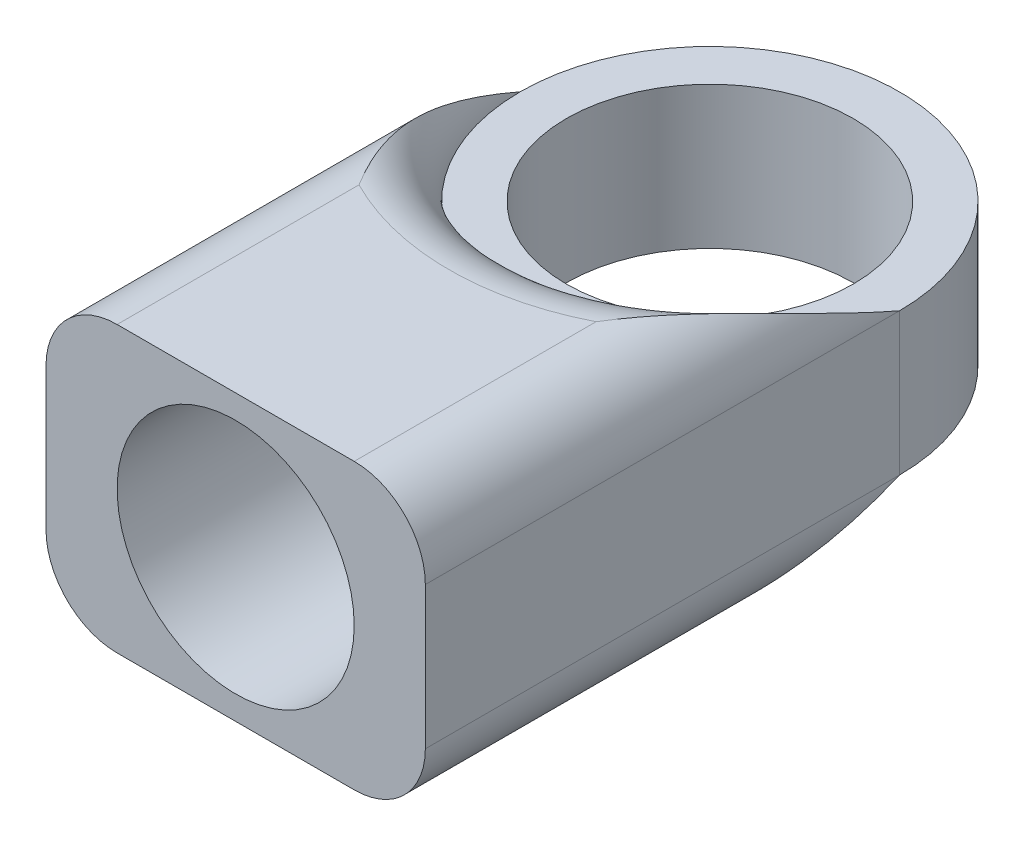
ISO-10303-21;
HEADER;
FILE_DESCRIPTION(('STEP AP214'),'2;1');
FILE_NAME('part.step','',(''),(''),'','','');
FILE_SCHEMA(('AUTOMOTIVE_DESIGN { 1 0 10303 214 1 1 1 1 }'));
ENDSEC;
DATA;
#1=APPLICATION_CONTEXT('core data for automotive mechanical design processes');
#2=APPLICATION_PROTOCOL_DEFINITION('international standard','automotive_design',2000,#1);
#3=PRODUCT_CONTEXT('',#1,'mechanical');
#4=PRODUCT('Part','Part','',(#3));
#5=PRODUCT_RELATED_PRODUCT_CATEGORY('part','',(#4));
#6=PRODUCT_DEFINITION_FORMATION('','',#4);
#7=PRODUCT_DEFINITION_CONTEXT('part definition',#1,'design');
#8=PRODUCT_DEFINITION('design','',#6,#7);
#9=PRODUCT_DEFINITION_SHAPE('','',#8);
#10=(LENGTH_UNIT() NAMED_UNIT(*) SI_UNIT(.MILLI.,.METRE.));
#11=(NAMED_UNIT(*) PLANE_ANGLE_UNIT() SI_UNIT($,.RADIAN.));
#12=(NAMED_UNIT(*) SI_UNIT($,.STERADIAN.) SOLID_ANGLE_UNIT());
#13=UNCERTAINTY_MEASURE_WITH_UNIT(LENGTH_MEASURE(1.E-05),#10,'distance_accuracy_value','');
#14=(GEOMETRIC_REPRESENTATION_CONTEXT(3) GLOBAL_UNCERTAINTY_ASSIGNED_CONTEXT((#13)) GLOBAL_UNIT_ASSIGNED_CONTEXT((#10,
#11,#12)) REPRESENTATION_CONTEXT('',''));
#15=CARTESIAN_POINT('',(0.,0.,0.));
#16=DIRECTION('',(0.,0.,1.));
#17=DIRECTION('',(1.,0.,0.));
#18=AXIS2_PLACEMENT_3D('',#15,#16,#17);
#19=CARTESIAN_POINT('',(-8.,6.,0.));
#20=DIRECTION('',(1.,0.,0.));
#21=DIRECTION('',(0.,0.,-1.));
#22=AXIS2_PLACEMENT_3D('',#19,#20,#21);
#23=PLANE('',#22);
#24=DIRECTION('',(0.,-1.,0.));
#25=VECTOR('',#24,1.);
#26=CARTESIAN_POINT('',(-8.,6.,10.));
#27=LINE('',#26,#25);
#28=CARTESIAN_POINT('',(-8.,3.,10.));
#29=VERTEX_POINT('',#28);
#30=CARTESIAN_POINT('',(-8.,-3.,10.));
#31=VERTEX_POINT('',#30);
#32=EDGE_CURVE('E204',#29,#31,#27,.T.);
#33=ORIENTED_EDGE('',*,*,#32,.F.);
#34=DIRECTION('',(0.,0.,1.));
#35=VECTOR('',#34,1.);
#36=CARTESIAN_POINT('',(-8.,3.,-2.45016556472924));
#37=LINE('',#36,#35);
#38=CARTESIAN_POINT('',(-8.,3.,-10.));
#39=VERTEX_POINT('',#38);
#40=EDGE_CURVE('E223',#29,#39,#37,.F.);
#41=ORIENTED_EDGE('',*,*,#40,.T.);
#42=DIRECTION('',(0.,-1.,0.));
#43=VECTOR('',#42,1.);
#44=CARTESIAN_POINT('',(-8.,3.,-10.));
#45=LINE('',#44,#43);
#46=CARTESIAN_POINT('',(-8.,-3.,-10.));
#47=VERTEX_POINT('',#46);
#48=EDGE_CURVE('E196',#47,#39,#45,.F.);
#49=ORIENTED_EDGE('',*,*,#48,.F.);
#50=DIRECTION('',(0.,0.,1.));
#51=VECTOR('',#50,1.);
#52=CARTESIAN_POINT('',(-8.,-3.,0.));
#53=LINE('',#52,#51);
#54=EDGE_CURVE('E221',#47,#31,#53,.T.);
#55=ORIENTED_EDGE('',*,*,#54,.T.);
#56=EDGE_LOOP('',(#33,#41,#49,#55));
#57=FACE_BOUND('',#56,.T.);
#58=ADVANCED_FACE('F37',(#57),#23,.F.);
#59=CARTESIAN_POINT('',(0.,6.,10.));
#60=DIRECTION('',(0.,0.,-1.));
#61=DIRECTION('',(-1.,0.,0.));
#62=AXIS2_PLACEMENT_3D('',#59,#60,#61);
#63=PLANE('',#62);
#64=CARTESIAN_POINT('',(0.,0.,10.));
#65=DIRECTION('',(0.,0.,1.));
#66=DIRECTION('',(1.,0.,0.));
#67=AXIS2_PLACEMENT_3D('',#64,#65,#66);
#68=CIRCLE('',#67,5.);
#69=CARTESIAN_POINT('',(5.,0.,10.));
#70=VERTEX_POINT('',#69);
#71=EDGE_CURVE('E245',#70,#70,#68,.T.);
#72=ORIENTED_EDGE('',*,*,#71,.F.);
#73=EDGE_LOOP('',(#72));
#74=FACE_BOUND('',#73,.T.);
#75=DIRECTION('',(1.,0.,0.));
#76=VECTOR('',#75,1.);
#77=CARTESIAN_POINT('',(0.,6.,10.));
#78=LINE('',#77,#76);
#79=CARTESIAN_POINT('',(-5.,6.,10.));
#80=VERTEX_POINT('',#79);
#81=CARTESIAN_POINT('',(5.,6.,10.));
#82=VERTEX_POINT('',#81);
#83=EDGE_CURVE('E124',#80,#82,#78,.T.);
#84=ORIENTED_EDGE('',*,*,#83,.F.);
#85=CARTESIAN_POINT('',(-5.,3.,10.));
#86=DIRECTION('',(0.,0.,-1.));
#87=DIRECTION('',(-1.,0.,0.));
#88=AXIS2_PLACEMENT_3D('',#85,#86,#87);
#89=CIRCLE('',#88,3.);
#90=EDGE_CURVE('E219',#80,#29,#89,.F.);
#91=ORIENTED_EDGE('',*,*,#90,.T.);
#92=ORIENTED_EDGE('',*,*,#32,.T.);
#93=CARTESIAN_POINT('',(-5.,-3.,10.));
#94=DIRECTION('',(0.,0.,-1.));
#95=DIRECTION('',(-1.,0.,0.));
#96=AXIS2_PLACEMENT_3D('',#93,#94,#95);
#97=CIRCLE('',#96,3.);
#98=CARTESIAN_POINT('',(-5.,-6.,10.));
#99=VERTEX_POINT('',#98);
#100=EDGE_CURVE('E195',#31,#99,#97,.F.);
#101=ORIENTED_EDGE('',*,*,#100,.T.);
#102=DIRECTION('',(1.,0.,0.));
#103=VECTOR('',#102,1.);
#104=CARTESIAN_POINT('',(0.,-6.,10.));
#105=LINE('',#104,#103);
#106=CARTESIAN_POINT('',(5.,-6.,10.));
#107=VERTEX_POINT('',#106);
#108=EDGE_CURVE('E188',#99,#107,#105,.T.);
#109=ORIENTED_EDGE('',*,*,#108,.T.);
#110=CARTESIAN_POINT('',(5.,-3.,10.));
#111=DIRECTION('',(0.,0.,-1.));
#112=DIRECTION('',(-1.,0.,0.));
#113=AXIS2_PLACEMENT_3D('',#110,#111,#112);
#114=CIRCLE('',#113,3.);
#115=CARTESIAN_POINT('',(8.,-3.,10.));
#116=VERTEX_POINT('',#115);
#117=EDGE_CURVE('E193',#107,#116,#114,.F.);
#118=ORIENTED_EDGE('',*,*,#117,.T.);
#119=DIRECTION('',(0.,-1.,0.));
#120=VECTOR('',#119,1.);
#121=CARTESIAN_POINT('',(8.,6.,10.));
#122=LINE('',#121,#120);
#123=CARTESIAN_POINT('',(8.,3.,10.));
#124=VERTEX_POINT('',#123);
#125=EDGE_CURVE('E111',#124,#116,#122,.T.);
#126=ORIENTED_EDGE('',*,*,#125,.F.);
#127=CARTESIAN_POINT('',(5.,3.,10.));
#128=DIRECTION('',(0.,0.,-1.));
#129=DIRECTION('',(-1.,0.,0.));
#130=AXIS2_PLACEMENT_3D('',#127,#128,#129);
#131=CIRCLE('',#130,3.);
#132=EDGE_CURVE('E215',#124,#82,#131,.F.);
#133=ORIENTED_EDGE('',*,*,#132,.T.);
#134=EDGE_LOOP('',(#84,#91,#92,#101,#109,#118,#126,#133));
#135=FACE_BOUND('',#134,.T.);
#136=ADVANCED_FACE('F192',(#74,#135),#63,.F.);
#137=CARTESIAN_POINT('',(8.,6.,0.));
#138=DIRECTION('',(1.,0.,0.));
#139=DIRECTION('',(0.,0.,-1.));
#140=AXIS2_PLACEMENT_3D('',#137,#138,#139);
#141=PLANE('',#140);
#142=ORIENTED_EDGE('',*,*,#125,.T.);
#143=DIRECTION('',(0.,0.,1.));
#144=VECTOR('',#143,1.);
#145=CARTESIAN_POINT('',(8.,-3.,-2.45016556472925));
#146=LINE('',#145,#144);
#147=CARTESIAN_POINT('',(8.,-3.,-10.));
#148=VERTEX_POINT('',#147);
#149=EDGE_CURVE('E11',#116,#148,#146,.F.);
#150=ORIENTED_EDGE('',*,*,#149,.T.);
#151=DIRECTION('',(0.,-1.,0.));
#152=VECTOR('',#151,1.);
#153=CARTESIAN_POINT('',(8.,6.,-10.));
#154=LINE('',#153,#152);
#155=CARTESIAN_POINT('',(8.,3.,-10.));
#156=VERTEX_POINT('',#155);
#157=EDGE_CURVE('E108',#156,#148,#154,.T.);
#158=ORIENTED_EDGE('',*,*,#157,.F.);
#159=DIRECTION('',(0.,0.,1.));
#160=VECTOR('',#159,1.);
#161=CARTESIAN_POINT('',(8.,3.,0.));
#162=LINE('',#161,#160);
#163=EDGE_CURVE('E46',#156,#124,#162,.T.);
#164=ORIENTED_EDGE('',*,*,#163,.T.);
#165=EDGE_LOOP('',(#142,#150,#158,#164));
#166=FACE_BOUND('',#165,.T.);
#167=ADVANCED_FACE('F106',(#166),#141,.T.);
#168=CARTESIAN_POINT('',(0.,6.,0.));
#169=DIRECTION('',(0.,1.,0.));
#170=DIRECTION('',(0.,0.,1.));
#171=AXIS2_PLACEMENT_3D('',#168,#169,#170);
#172=PLANE('',#171);
#173=CARTESIAN_POINT('',(0.,6.,-10.));
#174=DIRECTION('',(0.,1.,0.));
#175=DIRECTION('',(0.,0.,1.));
#176=AXIS2_PLACEMENT_3D('',#173,#174,#175);
#177=CIRCLE('',#176,11.);
#178=CARTESIAN_POINT('',(5.,6.,-0.202041028867284));
#179=VERTEX_POINT('',#178);
#180=CARTESIAN_POINT('',(-5.,6.,-0.202041028867282));
#181=VERTEX_POINT('',#180);
#182=EDGE_CURVE('E207',#179,#181,#177,.F.);
#183=ORIENTED_EDGE('',*,*,#182,.T.);
#184=DIRECTION('',(0.,0.,1.));
#185=VECTOR('',#184,1.);
#186=CARTESIAN_POINT('',(-5.,6.,10.));
#187=LINE('',#186,#185);
#188=EDGE_CURVE('E212',#181,#80,#187,.T.);
#189=ORIENTED_EDGE('',*,*,#188,.T.);
#190=ORIENTED_EDGE('',*,*,#83,.T.);
#191=DIRECTION('',(0.,0.,1.));
#192=VECTOR('',#191,1.);
#193=CARTESIAN_POINT('',(5.,6.,0.));
#194=LINE('',#193,#192);
#195=EDGE_CURVE('E210',#82,#179,#194,.F.);
#196=ORIENTED_EDGE('',*,*,#195,.T.);
#197=EDGE_LOOP('',(#183,#189,#190,#196));
#198=FACE_BOUND('',#197,.T.);
#199=ADVANCED_FACE('F236',(#198),#172,.T.);
#200=CARTESIAN_POINT('',(0.,-6.,0.));
#201=DIRECTION('',(0.,1.,0.));
#202=DIRECTION('',(0.,0.,1.));
#203=AXIS2_PLACEMENT_3D('',#200,#201,#202);
#204=PLANE('',#203);
#205=ORIENTED_EDGE('',*,*,#108,.F.);
#206=DIRECTION('',(0.,0.,1.));
#207=VECTOR('',#206,1.);
#208=CARTESIAN_POINT('',(-5.,-6.,0.));
#209=LINE('',#208,#207);
#210=CARTESIAN_POINT('',(-5.,-6.,-0.202041028867282));
#211=VERTEX_POINT('',#210);
#212=EDGE_CURVE('E60',#99,#211,#209,.F.);
#213=ORIENTED_EDGE('',*,*,#212,.T.);
#214=CARTESIAN_POINT('',(0.,-6.,-10.));
#215=DIRECTION('',(0.,1.,0.));
#216=DIRECTION('',(0.,0.,1.));
#217=AXIS2_PLACEMENT_3D('',#214,#215,#216);
#218=CIRCLE('',#217,11.);
#219=CARTESIAN_POINT('',(5.,-6.,-0.202041028867284));
#220=VERTEX_POINT('',#219);
#221=EDGE_CURVE('E189',#211,#220,#218,.T.);
#222=ORIENTED_EDGE('',*,*,#221,.T.);
#223=DIRECTION('',(0.,0.,1.));
#224=VECTOR('',#223,1.);
#225=CARTESIAN_POINT('',(5.,-6.,10.));
#226=LINE('',#225,#224);
#227=EDGE_CURVE('E141',#220,#107,#226,.T.);
#228=ORIENTED_EDGE('',*,*,#227,.T.);
#229=EDGE_LOOP('',(#205,#213,#222,#228));
#230=FACE_BOUND('',#229,.T.);
#231=ADVANCED_FACE('F187',(#230),#204,.F.);
#232=CARTESIAN_POINT('',(0.,3.,-10.));
#233=DIRECTION('',(0.,-1.,0.));
#234=DIRECTION('',(0.,0.,-1.));
#235=AXIS2_PLACEMENT_3D('',#232,#233,#234);
#236=CYLINDRICAL_SURFACE('',#235,8.00000000000001);
#237=CARTESIAN_POINT('',(0.,-3.,-10.));
#238=DIRECTION('',(0.,1.,0.));
#239=DIRECTION('',(0.,0.,1.));
#240=AXIS2_PLACEMENT_3D('',#237,#238,#239);
#241=CIRCLE('',#240,8.00000000000001);
#242=EDGE_CURVE('E119',#148,#47,#241,.T.);
#243=ORIENTED_EDGE('',*,*,#242,.T.);
#244=ORIENTED_EDGE('',*,*,#48,.T.);
#245=CARTESIAN_POINT('',(0.,3.,-10.));
#246=DIRECTION('',(0.,1.,0.));
#247=DIRECTION('',(0.,0.,1.));
#248=AXIS2_PLACEMENT_3D('',#245,#246,#247);
#249=CIRCLE('',#248,8.00000000000001);
#250=EDGE_CURVE('E122',#156,#39,#249,.T.);
#251=ORIENTED_EDGE('',*,*,#250,.F.);
#252=ORIENTED_EDGE('',*,*,#157,.T.);
#253=EDGE_LOOP('',(#243,#244,#251,#252));
#254=FACE_BOUND('',#253,.T.);
#255=ADVANCED_FACE('F117',(#254),#236,.T.);
#256=CARTESIAN_POINT('',(0.,3.,-10.));
#257=DIRECTION('',(0.,-1.,0.));
#258=DIRECTION('',(0.,0.,-1.));
#259=AXIS2_PLACEMENT_3D('',#256,#257,#258);
#260=CYLINDRICAL_SURFACE('',#259,6.05);
#261=CARTESIAN_POINT('',(0.,3.,-10.));
#262=DIRECTION('',(0.,1.,0.));
#263=DIRECTION('',(0.,0.,1.));
#264=AXIS2_PLACEMENT_3D('',#261,#262,#263);
#265=CIRCLE('',#264,6.05);
#266=CARTESIAN_POINT('',(0.,3.,-3.95));
#267=VERTEX_POINT('',#266);
#268=EDGE_CURVE('E200',#267,#267,#265,.T.);
#269=ORIENTED_EDGE('',*,*,#268,.T.);
#270=EDGE_LOOP('',(#269));
#271=FACE_BOUND('',#270,.T.);
#272=CARTESIAN_POINT('',(0.,-3.,-10.));
#273=DIRECTION('',(0.,1.,0.));
#274=DIRECTION('',(0.,0.,1.));
#275=AXIS2_PLACEMENT_3D('',#272,#273,#274);
#276=CIRCLE('',#275,6.05);
#277=CARTESIAN_POINT('',(0.,-3.,-3.95));
#278=VERTEX_POINT('',#277);
#279=EDGE_CURVE('E131',#278,#278,#276,.T.);
#280=ORIENTED_EDGE('',*,*,#279,.F.);
#281=EDGE_LOOP('',(#280));
#282=FACE_BOUND('',#281,.T.);
#283=ADVANCED_FACE('F251',(#271,#282),#260,.F.);
#284=CARTESIAN_POINT('',(0.,3.,0.));
#285=DIRECTION('',(0.,1.,0.));
#286=DIRECTION('',(0.,0.,1.));
#287=AXIS2_PLACEMENT_3D('',#284,#285,#286);
#288=PLANE('',#287);
#289=ORIENTED_EDGE('',*,*,#250,.T.);
#290=EDGE_CURVE('E231',#39,#156,#249,.T.);
#291=ORIENTED_EDGE('',*,*,#290,.T.);
#292=EDGE_LOOP('',(#289,#291));
#293=FACE_BOUND('',#292,.T.);
#294=ORIENTED_EDGE('',*,*,#268,.F.);
#295=EDGE_LOOP('',(#294));
#296=FACE_BOUND('',#295,.T.);
#297=ADVANCED_FACE('F239',(#293,#296),#288,.T.);
#298=CARTESIAN_POINT('',(0.,-3.,0.));
#299=DIRECTION('',(0.,1.,0.));
#300=DIRECTION('',(0.,0.,1.));
#301=AXIS2_PLACEMENT_3D('',#298,#299,#300);
#302=PLANE('',#301);
#303=ORIENTED_EDGE('',*,*,#242,.F.);
#304=EDGE_CURVE('E130',#47,#148,#241,.T.);
#305=ORIENTED_EDGE('',*,*,#304,.F.);
#306=EDGE_LOOP('',(#303,#305));
#307=FACE_BOUND('',#306,.T.);
#308=ORIENTED_EDGE('',*,*,#279,.T.);
#309=EDGE_LOOP('',(#308));
#310=FACE_BOUND('',#309,.T.);
#311=ADVANCED_FACE('F128',(#307,#310),#302,.F.);
#312=CARTESIAN_POINT('',(0.,-3.,-10.));
#313=DIRECTION('',(0.,1.,0.));
#314=DIRECTION('',(0.,0.,1.));
#315=AXIS2_PLACEMENT_3D('',#312,#313,#314);
#316=TOROIDAL_SURFACE('',#315,11.,3.);
#317=ORIENTED_EDGE('',*,*,#221,.F.);
#318=CARTESIAN_POINT('',(-8.00000000000001,-3.,-10.));
#319=CARTESIAN_POINT('',(-8.00000000238187,-3.00236938429621,-9.99452814085888));
#320=CARTESIAN_POINT('',(-7.99999719533205,-3.00473878022632,-9.98905625536137));
#321=CARTESIAN_POINT('',(-7.99956607533284,-3.18661668814079,-9.56902637174416));
#322=CARTESIAN_POINT('',(-7.98301569809308,-3.36616064541197,-9.15432309087172));
#323=CARTESIAN_POINT('',(-7.91772871403377,-3.72067669595112,-8.32528849779677));
#324=CARTESIAN_POINT('',(-7.86897330662509,-3.89564605660742,-7.9109575445133));
#325=CARTESIAN_POINT('',(-7.73934080786373,-4.23667967435584,-7.08225727863208));
#326=CARTESIAN_POINT('',(-7.65837628085581,-4.40271828341701,-6.66789095674307));
#327=CARTESIAN_POINT('',(-7.46481833790684,-4.72024135746883,-5.84107810714184));
#328=CARTESIAN_POINT('',(-7.35223569790133,-4.87173075748743,-5.42863097394107));
#329=CARTESIAN_POINT('',(-7.11649587038113,-5.1321862440565,-4.67160074022123));
#330=CARTESIAN_POINT('',(-6.9978429429415,-5.24408653724895,-4.32662260711334));
#331=CARTESIAN_POINT('',(-6.73928462531251,-5.44993919136526,-3.63909986623909));
#332=CARTESIAN_POINT('',(-6.59937379206972,-5.54388694161948,-3.29655590531998));
#333=CARTESIAN_POINT('',(-6.29988146814707,-5.70914259522496,-2.61629871375462));
#334=CARTESIAN_POINT('',(-6.14038126549099,-5.78053994092437,-2.27857160411872));
#335=CARTESIAN_POINT('',(-5.80270467561814,-5.89611550447883,-1.60800231284478));
#336=CARTESIAN_POINT('',(-5.62454672824729,-5.94032030569349,-1.27515567188873));
#337=CARTESIAN_POINT('',(-5.36833308575712,-5.97813629419555,-0.822385987564284));
#338=CARTESIAN_POINT('',(-5.29738185072591,-5.98609810731002,-0.699528895858318));
#339=CARTESIAN_POINT('',(-5.15330476854414,-5.99695141374966,-0.454886570779086));
#340=CARTESIAN_POINT('',(-5.0801794915898,-5.99984422482155,-0.333101067027439));
#341=CARTESIAN_POINT('',(-5.0040402836105,-5.99999795740113,-0.208640449523039));
#342=CARTESIAN_POINT('',(-5.00202050989815,-5.99999999855977,-0.205340506138666));
#343=CARTESIAN_POINT('',(-5.,-6.,-0.202041028867282));
#344=B_SPLINE_CURVE_WITH_KNOTS('',3,(#318,#319,#320,#321,#322,#323,#324,#325,#326,#327,#328,
#329,#330,#331,#332,#333,#334,#335,#336,#337,#338,#339,#340,#341,#342,#343),.UNSPECIFIED.,.F.,
.F.,(4,2,2,2,2,2,2,2,2,2,2,2,4),(0.,0.0178885458022666,1.37314442199724,2.72919216685201,
4.08894646957498,5.44823790849126,6.59208561892515,7.73622670487745,8.87577104149564,
10.0141995847887,10.4404105615964,10.8665107234004,10.8781177032022),.UNSPECIFIED.);
#345=EDGE_CURVE('E135',#211,#47,#344,.F.);
#346=ORIENTED_EDGE('',*,*,#345,.T.);
#347=ORIENTED_EDGE('',*,*,#304,.T.);
#348=CARTESIAN_POINT('',(8.,-3.,-10.));
#349=CARTESIAN_POINT('',(8.00000000238187,-3.00236938429656,-9.99452814085903));
#350=CARTESIAN_POINT('',(7.99999719533205,-3.00473878022702,-9.98905625536167));
#351=CARTESIAN_POINT('',(7.99956607533283,-3.18661668816734,-9.56902637175599));
#352=CARTESIAN_POINT('',(7.9830156980931,-3.36616064541889,-9.15432309087538));
#353=CARTESIAN_POINT('',(7.91772871403387,-3.72067669594354,-8.32528849779472));
#354=CARTESIAN_POINT('',(7.86897330662525,-3.89564605660499,-7.91095754451371));
#355=CARTESIAN_POINT('',(7.73934080786394,-4.23667967435731,-7.08225727863404));
#356=CARTESIAN_POINT('',(7.65837628085598,-4.40271828341721,-6.66789095674409));
#357=CARTESIAN_POINT('',(7.46481833790693,-4.7202413574682,-5.84107810714194));
#358=CARTESIAN_POINT('',(7.35223569790137,-4.87173075748725,-5.42863097394118));
#359=CARTESIAN_POINT('',(7.11649587038367,-5.13218624405381,-4.67160074022941));
#360=CARTESIAN_POINT('',(6.9978429429471,-5.24408653724371,-4.32662260712958));
#361=CARTESIAN_POINT('',(6.73928462532513,-5.44993919135598,-3.63909986627134));
#362=CARTESIAN_POINT('',(6.5993737920863,-5.54388694160871,-3.29655590536018));
#363=CARTESIAN_POINT('',(6.29988146817301,-5.70914259521225,-2.61629871381104));
#364=CARTESIAN_POINT('',(6.14038126552238,-5.78053994091127,-2.27857160418339));
#365=CARTESIAN_POINT('',(5.80270467566029,-5.89611550446675,-1.60800231292615));
#366=CARTESIAN_POINT('',(5.62454672829476,-5.94032030568281,-1.27515567197855));
#367=CARTESIAN_POINT('',(5.36833308580381,-5.97813629419003,-0.822385987644575));
#368=CARTESIAN_POINT('',(5.29738185076439,-5.98609810730651,-0.69952889592197));
#369=CARTESIAN_POINT('',(5.15330476856231,-5.9969514137489,-0.454886570811649));
#370=CARTESIAN_POINT('',(5.08017949159589,-5.99984422482153,-0.33310106704555));
#371=CARTESIAN_POINT('',(5.0040402836103,-5.99999795740113,-0.208640449523156));
#372=CARTESIAN_POINT('',(5.00202050989805,-5.99999999855977,-0.205340506138727));
#373=CARTESIAN_POINT('',(5.,-6.,-0.202041028867284));
#374=B_SPLINE_CURVE_WITH_KNOTS('',3,(#348,#349,#350,#351,#352,#353,#354,#355,#356,#357,#358,
#359,#360,#361,#362,#363,#364,#365,#366,#367,#368,#369,#370,#371,#372,#373),.UNSPECIFIED.,.F.,
.F.,(4,2,2,2,2,2,2,2,2,2,2,2,4),(0.,0.0178885458022635,1.37314442199633,2.72919216685043,
4.08894646957446,5.44823790849126,6.59208561889825,7.7362267048238,8.87577104141295,
10.0141995846772,10.4404105615406,10.8665107234005,10.8781177032023),.UNSPECIFIED.);
#375=EDGE_CURVE('E53',#148,#220,#374,.T.);
#376=ORIENTED_EDGE('',*,*,#375,.T.);
#377=EDGE_LOOP('',(#317,#346,#347,#376));
#378=FACE_BOUND('',#377,.T.);
#379=ADVANCED_FACE('F133',(#378),#316,.T.);
#380=CARTESIAN_POINT('',(0.,3.,-10.));
#381=DIRECTION('',(0.,1.,0.));
#382=DIRECTION('',(0.,0.,1.));
#383=AXIS2_PLACEMENT_3D('',#380,#381,#382);
#384=TOROIDAL_SURFACE('',#383,11.,3.);
#385=ORIENTED_EDGE('',*,*,#290,.F.);
#386=CARTESIAN_POINT('',(-8.00000000000001,3.,-10.));
#387=CARTESIAN_POINT('',(-8.00000000238187,3.00236938429621,-9.99452814085888));
#388=CARTESIAN_POINT('',(-7.99999719533205,3.00473878022632,-9.98905625536137));
#389=CARTESIAN_POINT('',(-7.99956607533284,3.1866166881408,-9.56902637174412));
#390=CARTESIAN_POINT('',(-7.98301569809308,3.366160645412,-9.15432309087164));
#391=CARTESIAN_POINT('',(-7.91772871403375,3.72067669595119,-8.32528849779661));
#392=CARTESIAN_POINT('',(-7.86897330662507,3.8956460566075,-7.9109575445131));
#393=CARTESIAN_POINT('',(-7.73934080786369,4.23667967435592,-7.08225727863188));
#394=CARTESIAN_POINT('',(-7.65837628085577,4.40271828341707,-6.66789095674291));
#395=CARTESIAN_POINT('',(-7.46481833790682,4.72024135746886,-5.84107810714176));
#396=CARTESIAN_POINT('',(-7.35223569790132,4.87173075748745,-5.42863097394102));
#397=CARTESIAN_POINT('',(-7.11649587038118,5.13218624405645,-4.67160074022139));
#398=CARTESIAN_POINT('',(-6.9978429429416,5.24408653724885,-4.32662260711368));
#399=CARTESIAN_POINT('',(-6.73928462531276,5.44993919136508,-3.63909986623973));
#400=CARTESIAN_POINT('',(-6.59937379207007,5.54388694161927,-3.29655590532075));
#401=CARTESIAN_POINT('',(-6.2998814681475,5.70914259522474,-2.61629871375561));
#402=CARTESIAN_POINT('',(-6.1403812654914,5.78053994092416,-2.27857160411978));
#403=CARTESIAN_POINT('',(-5.80270467561879,5.89611550447867,-1.60800231284582));
#404=CARTESIAN_POINT('',(-5.62454672824822,5.94032030569336,-1.27515567188969));
#405=CARTESIAN_POINT('',(-5.36833308575758,5.97813629419548,-0.822385987565338));
#406=CARTESIAN_POINT('',(-5.29738185072607,5.98609810730998,-0.699528895859278));
#407=CARTESIAN_POINT('',(-5.15330476854467,5.99695141374965,-0.454886570779283));
#408=CARTESIAN_POINT('',(-5.08017949159101,5.99984422482155,-0.333101067026966));
#409=CARTESIAN_POINT('',(-5.00404028361056,5.99999795740113,-0.208640449523005));
#410=CARTESIAN_POINT('',(-5.00202050989818,5.99999999855977,-0.205340506138649));
#411=CARTESIAN_POINT('',(-5.,6.,-0.202041028867282));
#412=B_SPLINE_CURVE_WITH_KNOTS('',3,(#386,#387,#388,#389,#390,#391,#392,#393,#394,#395,#396,
#397,#398,#399,#400,#401,#402,#403,#404,#405,#406,#407,#408,#409,#410,#411),.UNSPECIFIED.,.F.,
.F.,(4,2,2,2,2,2,2,2,2,2,2,2,4),(0.,0.0178885458022666,1.37314442199736,2.72919216685226,
4.08894646957512,5.44823790849126,6.59208561892461,7.73622670487641,8.87577104149446,
10.0141995847873,10.4404105615957,10.8665107234004,10.8781177032022),.UNSPECIFIED.);
#413=EDGE_CURVE('E174',#39,#181,#412,.T.);
#414=ORIENTED_EDGE('',*,*,#413,.T.);
#415=ORIENTED_EDGE('',*,*,#182,.F.);
#416=CARTESIAN_POINT('',(8.,3.,-10.));
#417=CARTESIAN_POINT('',(8.00000000238187,3.00236938429656,-9.99452814085903));
#418=CARTESIAN_POINT('',(7.99999719533205,3.00473878022702,-9.98905625536167));
#419=CARTESIAN_POINT('',(7.99956607533283,3.18661668816727,-9.56902637175582));
#420=CARTESIAN_POINT('',(7.98301569809309,3.36616064541896,-9.15432309087513));
#421=CARTESIAN_POINT('',(7.91772871403382,3.72067669594378,-8.32528849779425));
#422=CARTESIAN_POINT('',(7.86897330662517,3.89564605660525,-7.91095754451312));
#423=CARTESIAN_POINT('',(7.73934080786382,4.23667967435755,-7.08225727863342));
#424=CARTESIAN_POINT('',(7.65837628085587,4.4027182834174,-6.66789095674359));
#425=CARTESIAN_POINT('',(7.46481833790686,4.7202413574683,-5.84107810714168));
#426=CARTESIAN_POINT('',(7.35223569790134,4.8717307574873,-5.42863097394104));
#427=CARTESIAN_POINT('',(7.11649587038155,5.13218624405614,-4.67160074022265));
#428=CARTESIAN_POINT('',(6.99784294294243,5.24408653724809,-4.3266226071161));
#429=CARTESIAN_POINT('',(6.73928462531461,5.4499391913637,-3.63909986624443));
#430=CARTESIAN_POINT('',(6.59937379207246,5.54388694161771,-3.29655590532655));
#431=CARTESIAN_POINT('',(6.29988146815136,5.70914259522284,-2.61629871376403));
#432=CARTESIAN_POINT('',(6.14038126549621,5.78053994092215,-2.27857160412972));
#433=CARTESIAN_POINT('',(5.80270467562554,5.89611550447672,-1.60800231285885));
#434=CARTESIAN_POINT('',(5.62454672825595,5.94032030569161,-1.27515567190429));
#435=CARTESIAN_POINT('',(5.36833308576527,5.97813629419457,-0.822385987578579));
#436=CARTESIAN_POINT('',(5.29738185073239,5.9860981073094,-0.699528895869796));
#437=CARTESIAN_POINT('',(5.15330476854769,5.99695141374953,-0.454886570784653));
#438=CARTESIAN_POINT('',(5.08017949159209,5.99984422482154,-0.333101067029911));
#439=CARTESIAN_POINT('',(5.00404028361053,5.99999795740113,-0.208640449523023));
#440=CARTESIAN_POINT('',(5.00202050989817,5.99999999855977,-0.205340506138659));
#441=CARTESIAN_POINT('',(5.,6.,-0.202041028867284));
#442=B_SPLINE_CURVE_WITH_KNOTS('',3,(#416,#417,#418,#419,#420,#421,#422,#423,#424,#425,#426,
#427,#428,#429,#430,#431,#432,#433,#434,#435,#436,#437,#438,#439,#440,#441),.UNSPECIFIED.,.F.,
.F.,(4,2,2,2,2,2,2,2,2,2,2,2,4),(0.,0.0178885458022632,1.37314442199671,2.72919216685122,
4.08894646957489,5.44823790849126,6.59208561892061,7.73622670486872,8.87577104148147,
10.014199584769,10.4404105615865,10.8665107234004,10.8781177032023),.UNSPECIFIED.);
#443=EDGE_CURVE('E180',#179,#156,#442,.F.);
#444=ORIENTED_EDGE('',*,*,#443,.T.);
#445=EDGE_LOOP('',(#385,#414,#415,#444));
#446=FACE_BOUND('',#445,.T.);
#447=ADVANCED_FACE('F171',(#446),#384,.T.);
#448=CARTESIAN_POINT('',(0.,0.,0.));
#449=DIRECTION('',(0.,0.,1.));
#450=DIRECTION('',(1.,0.,0.));
#451=AXIS2_PLACEMENT_3D('',#448,#449,#450);
#452=CYLINDRICAL_SURFACE('',#451,5.);
#453=CARTESIAN_POINT('',(0.,0.,0.));
#454=DIRECTION('',(0.,0.,1.));
#455=DIRECTION('',(1.,0.,0.));
#456=AXIS2_PLACEMENT_3D('',#453,#454,#455);
#457=CIRCLE('',#456,5.);
#458=CARTESIAN_POINT('',(5.,0.,0.));
#459=VERTEX_POINT('',#458);
#460=EDGE_CURVE('E137',#459,#459,#457,.T.);
#461=ORIENTED_EDGE('',*,*,#460,.F.);
#462=EDGE_LOOP('',(#461));
#463=FACE_BOUND('',#462,.T.);
#464=ORIENTED_EDGE('',*,*,#71,.T.);
#465=EDGE_LOOP('',(#464));
#466=FACE_BOUND('',#465,.T.);
#467=ADVANCED_FACE('F318',(#463,#466),#452,.F.);
#468=CARTESIAN_POINT('',(0.,0.,0.));
#469=DIRECTION('',(0.,0.,1.));
#470=DIRECTION('',(1.,0.,0.));
#471=AXIS2_PLACEMENT_3D('',#468,#469,#470);
#472=PLANE('',#471);
#473=ORIENTED_EDGE('',*,*,#460,.T.);
#474=EDGE_LOOP('',(#473));
#475=FACE_BOUND('',#474,.T.);
#476=ADVANCED_FACE('F169',(#475),#472,.T.);
#477=CARTESIAN_POINT('',(-5.,3.,0.));
#478=DIRECTION('',(0.,0.,-1.));
#479=DIRECTION('',(-1.,0.,0.));
#480=AXIS2_PLACEMENT_3D('',#477,#478,#479);
#481=CYLINDRICAL_SURFACE('',#480,3.);
#482=ORIENTED_EDGE('',*,*,#413,.F.);
#483=ORIENTED_EDGE('',*,*,#40,.F.);
#484=ORIENTED_EDGE('',*,*,#90,.F.);
#485=ORIENTED_EDGE('',*,*,#188,.F.);
#486=EDGE_LOOP('',(#482,#483,#484,#485));
#487=FACE_BOUND('',#486,.T.);
#488=ADVANCED_FACE('F165',(#487),#481,.T.);
#489=CARTESIAN_POINT('',(-5.,-3.,0.));
#490=DIRECTION('',(0.,0.,1.));
#491=DIRECTION('',(1.,0.,0.));
#492=AXIS2_PLACEMENT_3D('',#489,#490,#491);
#493=CYLINDRICAL_SURFACE('',#492,3.);
#494=ORIENTED_EDGE('',*,*,#345,.F.);
#495=ORIENTED_EDGE('',*,*,#212,.F.);
#496=ORIENTED_EDGE('',*,*,#100,.F.);
#497=ORIENTED_EDGE('',*,*,#54,.F.);
#498=EDGE_LOOP('',(#494,#495,#496,#497));
#499=FACE_BOUND('',#498,.T.);
#500=ADVANCED_FACE('F161',(#499),#493,.T.);
#501=CARTESIAN_POINT('',(5.,-3.,0.));
#502=DIRECTION('',(0.,0.,-1.));
#503=DIRECTION('',(-1.,0.,0.));
#504=AXIS2_PLACEMENT_3D('',#501,#502,#503);
#505=CYLINDRICAL_SURFACE('',#504,3.);
#506=ORIENTED_EDGE('',*,*,#375,.F.);
#507=ORIENTED_EDGE('',*,*,#149,.F.);
#508=ORIENTED_EDGE('',*,*,#117,.F.);
#509=ORIENTED_EDGE('',*,*,#227,.F.);
#510=EDGE_LOOP('',(#506,#507,#508,#509));
#511=FACE_BOUND('',#510,.T.);
#512=ADVANCED_FACE('F139',(#511),#505,.T.);
#513=CARTESIAN_POINT('',(5.,3.,0.));
#514=DIRECTION('',(0.,0.,1.));
#515=DIRECTION('',(1.,0.,0.));
#516=AXIS2_PLACEMENT_3D('',#513,#514,#515);
#517=CYLINDRICAL_SURFACE('',#516,3.);
#518=ORIENTED_EDGE('',*,*,#443,.F.);
#519=ORIENTED_EDGE('',*,*,#195,.F.);
#520=ORIENTED_EDGE('',*,*,#132,.F.);
#521=ORIENTED_EDGE('',*,*,#163,.F.);
#522=EDGE_LOOP('',(#518,#519,#520,#521));
#523=FACE_BOUND('',#522,.T.);
#524=ADVANCED_FACE('F39',(#523),#517,.T.);
#525=CLOSED_SHELL('',(#58,#136,#167,#199,#231,#255,#283,#297,#311,#379,#447,#467,#476,#488,#500,
#512,#524));
#526=MANIFOLD_SOLID_BREP('B2',#525);
#527=ADVANCED_BREP_SHAPE_REPRESENTATION('',(#18,#526),#14);
#528=SHAPE_DEFINITION_REPRESENTATION(#9,#527);
ENDSEC;
END-ISO-10303-21;
